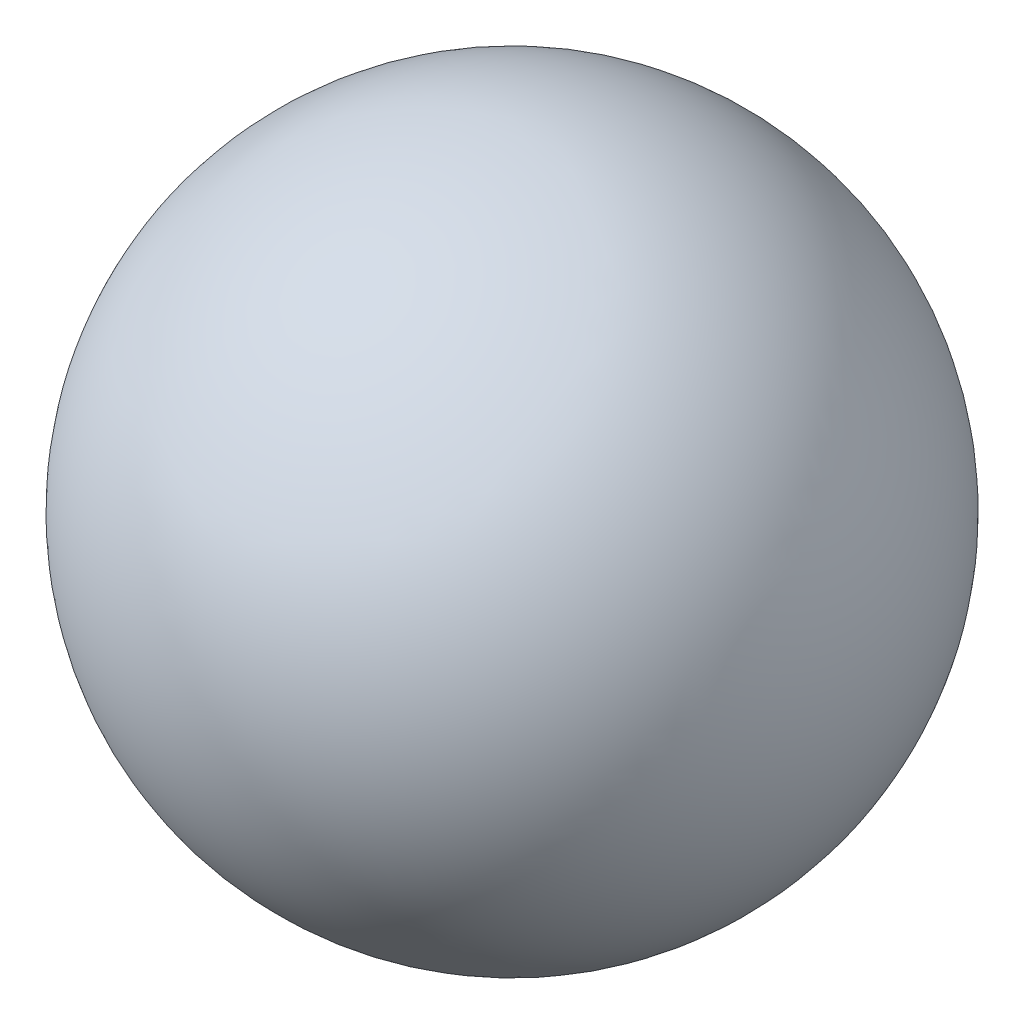
ISO-10303-21;
HEADER;
FILE_DESCRIPTION(('STEP AP214'),'2;1');
FILE_NAME('part.step','',(''),(''),'','','');
FILE_SCHEMA(('AUTOMOTIVE_DESIGN { 1 0 10303 214 1 1 1 1 }'));
ENDSEC;
DATA;
#1=APPLICATION_CONTEXT('core data for automotive mechanical design processes');
#2=APPLICATION_PROTOCOL_DEFINITION('international standard','automotive_design',2000,#1);
#3=PRODUCT_CONTEXT('',#1,'mechanical');
#4=PRODUCT('Part','Part','',(#3));
#5=PRODUCT_RELATED_PRODUCT_CATEGORY('part','',(#4));
#6=PRODUCT_DEFINITION_FORMATION('','',#4);
#7=PRODUCT_DEFINITION_CONTEXT('part definition',#1,'design');
#8=PRODUCT_DEFINITION('design','',#6,#7);
#9=PRODUCT_DEFINITION_SHAPE('','',#8);
#10=(LENGTH_UNIT() NAMED_UNIT(*) SI_UNIT(.MILLI.,.METRE.));
#11=(NAMED_UNIT(*) PLANE_ANGLE_UNIT() SI_UNIT($,.RADIAN.));
#12=(NAMED_UNIT(*) SI_UNIT($,.STERADIAN.) SOLID_ANGLE_UNIT());
#13=UNCERTAINTY_MEASURE_WITH_UNIT(LENGTH_MEASURE(1.E-05),#10,'distance_accuracy_value','');
#14=(GEOMETRIC_REPRESENTATION_CONTEXT(3) GLOBAL_UNCERTAINTY_ASSIGNED_CONTEXT((#13)) GLOBAL_UNIT_ASSIGNED_CONTEXT((#10,
#11,#12)) REPRESENTATION_CONTEXT('',''));
#15=CARTESIAN_POINT('',(0.,0.,0.));
#16=DIRECTION('',(0.,0.,1.));
#17=DIRECTION('',(1.,0.,0.));
#18=AXIS2_PLACEMENT_3D('',#15,#16,#17);
#19=CARTESIAN_POINT('',(3.26140673907344,0.,0.));
#20=DIRECTION('',(-1.,0.,0.));
#21=DIRECTION('',(0.,0.,1.));
#22=AXIS2_PLACEMENT_3D('',#19,#20,#21);
#23=SPHERICAL_SURFACE('',#22,9.15);
#24=CARTESIAN_POINT('',(-5.88859326092655,0.,0.));
#25=VERTEX_POINT('',#24);
#26=VERTEX_LOOP('',#25);
#27=FACE_BOUND('',#26,.T.);
#28=ADVANCED_FACE('F31',(#27),#23,.T.);
#29=CLOSED_SHELL('',(#28));
#30=MANIFOLD_SOLID_BREP('B2',#29);
#31=ADVANCED_BREP_SHAPE_REPRESENTATION('',(#18,#30),#14);
#32=SHAPE_DEFINITION_REPRESENTATION(#9,#31);
ENDSEC;
END-ISO-10303-21;
